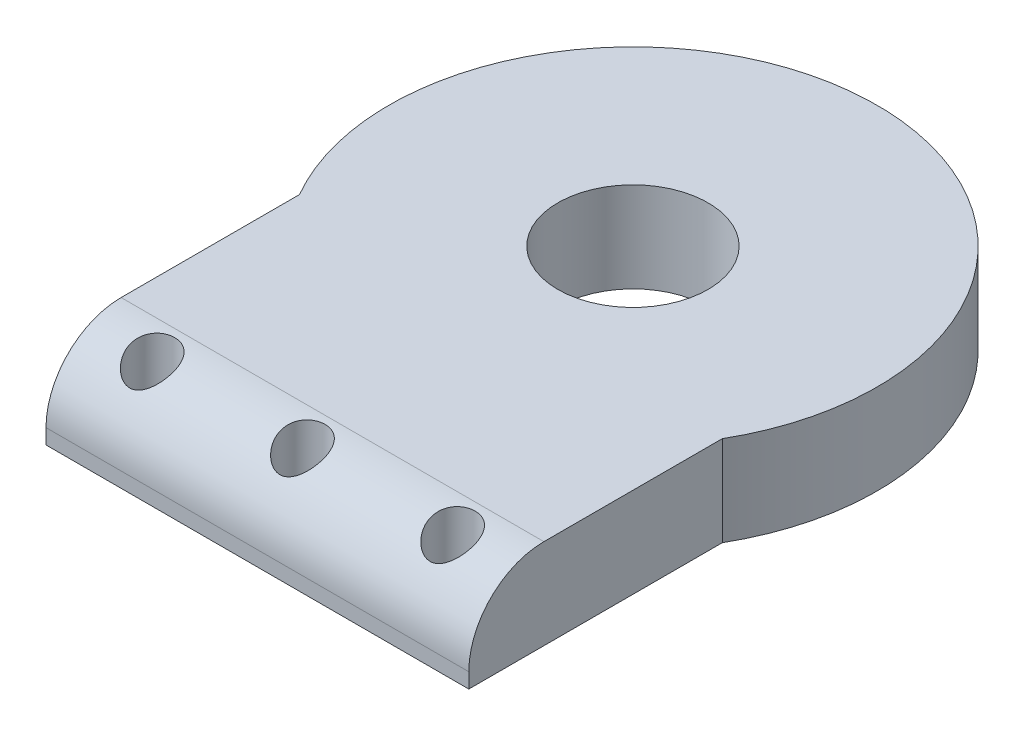
ISO-10303-21;
HEADER;
FILE_DESCRIPTION(('STEP AP214'),'2;1');
FILE_NAME('part.step','',(''),(''),'','','');
FILE_SCHEMA(('AUTOMOTIVE_DESIGN { 1 0 10303 214 1 1 1 1 }'));
ENDSEC;
DATA;
#1=APPLICATION_CONTEXT('core data for automotive mechanical design processes');
#2=APPLICATION_PROTOCOL_DEFINITION('international standard','automotive_design',2000,#1);
#3=PRODUCT_CONTEXT('',#1,'mechanical');
#4=PRODUCT('Part','Part','',(#3));
#5=PRODUCT_RELATED_PRODUCT_CATEGORY('part','',(#4));
#6=PRODUCT_DEFINITION_FORMATION('','',#4);
#7=PRODUCT_DEFINITION_CONTEXT('part definition',#1,'design');
#8=PRODUCT_DEFINITION('design','',#6,#7);
#9=PRODUCT_DEFINITION_SHAPE('','',#8);
#10=(LENGTH_UNIT() NAMED_UNIT(*) SI_UNIT(.MILLI.,.METRE.));
#11=(NAMED_UNIT(*) PLANE_ANGLE_UNIT() SI_UNIT($,.RADIAN.));
#12=(NAMED_UNIT(*) SI_UNIT($,.STERADIAN.) SOLID_ANGLE_UNIT());
#13=UNCERTAINTY_MEASURE_WITH_UNIT(LENGTH_MEASURE(1.E-05),#10,'distance_accuracy_value','');
#14=(GEOMETRIC_REPRESENTATION_CONTEXT(3) GLOBAL_UNCERTAINTY_ASSIGNED_CONTEXT((#13)) GLOBAL_UNIT_ASSIGNED_CONTEXT((#10,
#11,#12)) REPRESENTATION_CONTEXT('',''));
#15=CARTESIAN_POINT('',(0.,0.,0.));
#16=DIRECTION('',(0.,0.,1.));
#17=DIRECTION('',(1.,0.,0.));
#18=AXIS2_PLACEMENT_3D('',#15,#16,#17);
#19=CARTESIAN_POINT('',(0.,12.,-50.));
#20=DIRECTION('',(0.,-1.,0.));
#21=DIRECTION('',(0.,0.,-1.));
#22=AXIS2_PLACEMENT_3D('',#19,#20,#21);
#23=CYLINDRICAL_SURFACE('',#22,32.5);
#24=CARTESIAN_POINT('',(0.,0.,-50.));
#25=DIRECTION('',(0.,1.,0.));
#26=DIRECTION('',(0.,0.,1.));
#27=AXIS2_PLACEMENT_3D('',#24,#25,#26);
#28=CIRCLE('',#27,32.5);
#29=CARTESIAN_POINT('',(28.1458256229943,0.,-33.75));
#30=VERTEX_POINT('',#29);
#31=CARTESIAN_POINT('',(-28.1458256229944,0.,-33.7500000000002));
#32=VERTEX_POINT('',#31);
#33=EDGE_CURVE('E105',#30,#32,#28,.T.);
#34=ORIENTED_EDGE('',*,*,#33,.T.);
#35=DIRECTION('',(0.,-1.,0.));
#36=VECTOR('',#35,1.);
#37=CARTESIAN_POINT('',(-28.1458256229944,12.,-33.7500000000002));
#38=LINE('',#37,#36);
#39=CARTESIAN_POINT('',(-28.1458256229944,12.,-33.7500000000002));
#40=VERTEX_POINT('',#39);
#41=EDGE_CURVE('E92',#40,#32,#38,.T.);
#42=ORIENTED_EDGE('',*,*,#41,.F.);
#43=CARTESIAN_POINT('',(0.,12.,-50.));
#44=DIRECTION('',(0.,1.,0.));
#45=DIRECTION('',(0.,0.,1.));
#46=AXIS2_PLACEMENT_3D('',#43,#44,#45);
#47=CIRCLE('',#46,32.5);
#48=CARTESIAN_POINT('',(28.1458256229943,12.,-33.75));
#49=VERTEX_POINT('',#48);
#50=EDGE_CURVE('E95',#49,#40,#47,.T.);
#51=ORIENTED_EDGE('',*,*,#50,.F.);
#52=DIRECTION('',(0.,-1.,0.));
#53=VECTOR('',#52,1.);
#54=CARTESIAN_POINT('',(28.1458256229943,12.,-33.75));
#55=LINE('',#54,#53);
#56=EDGE_CURVE('E266',#49,#30,#55,.T.);
#57=ORIENTED_EDGE('',*,*,#56,.T.);
#58=EDGE_LOOP('',(#34,#42,#51,#57));
#59=FACE_BOUND('',#58,.T.);
#60=ADVANCED_FACE('F38',(#59),#23,.T.);
#61=CARTESIAN_POINT('',(-28.1458256229944,12.,0.));
#62=DIRECTION('',(-1.,0.,0.));
#63=DIRECTION('',(0.,0.,1.));
#64=AXIS2_PLACEMENT_3D('',#61,#62,#63);
#65=PLANE('',#64);
#66=DIRECTION('',(0.,-1.,0.));
#67=VECTOR('',#66,1.);
#68=CARTESIAN_POINT('',(-28.1458256229944,12.,0.));
#69=LINE('',#68,#67);
#70=CARTESIAN_POINT('',(-28.1458256229944,2.,0.));
#71=VERTEX_POINT('',#70);
#72=CARTESIAN_POINT('',(-28.1458256229944,0.,0.));
#73=VERTEX_POINT('',#72);
#74=EDGE_CURVE('E108',#71,#73,#69,.T.);
#75=ORIENTED_EDGE('',*,*,#74,.F.);
#76=CARTESIAN_POINT('',(-28.1458256229944,2.,-10.));
#77=DIRECTION('',(-1.,0.,0.));
#78=DIRECTION('',(0.,0.,1.));
#79=AXIS2_PLACEMENT_3D('',#76,#77,#78);
#80=CIRCLE('',#79,10.);
#81=CARTESIAN_POINT('',(-28.1458256229944,12.,-10.));
#82=VERTEX_POINT('',#81);
#83=EDGE_CURVE('E67',#71,#82,#80,.T.);
#84=ORIENTED_EDGE('',*,*,#83,.T.);
#85=DIRECTION('',(0.,0.,-1.));
#86=VECTOR('',#85,1.);
#87=CARTESIAN_POINT('',(-28.1458256229944,12.,0.));
#88=LINE('',#87,#86);
#89=EDGE_CURVE('E87',#82,#40,#88,.T.);
#90=ORIENTED_EDGE('',*,*,#89,.T.);
#91=ORIENTED_EDGE('',*,*,#41,.T.);
#92=DIRECTION('',(0.,0.,-1.));
#93=VECTOR('',#92,1.);
#94=CARTESIAN_POINT('',(-28.1458256229944,0.,0.));
#95=LINE('',#94,#93);
#96=EDGE_CURVE('E268',#73,#32,#95,.T.);
#97=ORIENTED_EDGE('',*,*,#96,.F.);
#98=EDGE_LOOP('',(#75,#84,#90,#91,#97));
#99=FACE_BOUND('',#98,.T.);
#100=ADVANCED_FACE('F89',(#99),#65,.T.);
#101=CARTESIAN_POINT('',(0.,12.,0.));
#102=DIRECTION('',(0.,0.,1.));
#103=DIRECTION('',(1.,0.,0.));
#104=AXIS2_PLACEMENT_3D('',#101,#102,#103);
#105=PLANE('',#104);
#106=DIRECTION('',(0.,-1.,0.));
#107=VECTOR('',#106,1.);
#108=CARTESIAN_POINT('',(28.1458256229942,12.,0.));
#109=LINE('',#108,#107);
#110=CARTESIAN_POINT('',(28.1458256229942,2.,0.));
#111=VERTEX_POINT('',#110);
#112=CARTESIAN_POINT('',(28.1458256229942,0.,0.));
#113=VERTEX_POINT('',#112);
#114=EDGE_CURVE('E112',#111,#113,#109,.T.);
#115=ORIENTED_EDGE('',*,*,#114,.F.);
#116=DIRECTION('',(-1.,0.,0.));
#117=VECTOR('',#116,1.);
#118=CARTESIAN_POINT('',(0.,2.,0.));
#119=LINE('',#118,#117);
#120=EDGE_CURVE('E107',#111,#71,#119,.T.);
#121=ORIENTED_EDGE('',*,*,#120,.T.);
#122=ORIENTED_EDGE('',*,*,#74,.T.);
#123=DIRECTION('',(-1.,0.,0.));
#124=VECTOR('',#123,1.);
#125=CARTESIAN_POINT('',(0.,0.,0.));
#126=LINE('',#125,#124);
#127=EDGE_CURVE('E270',#113,#73,#126,.T.);
#128=ORIENTED_EDGE('',*,*,#127,.F.);
#129=EDGE_LOOP('',(#115,#121,#122,#128));
#130=FACE_BOUND('',#129,.T.);
#131=ADVANCED_FACE('F148',(#130),#105,.T.);
#132=CARTESIAN_POINT('',(28.1458256229942,12.,0.));
#133=DIRECTION('',(-1.,0.,0.));
#134=DIRECTION('',(0.,0.,1.));
#135=AXIS2_PLACEMENT_3D('',#132,#133,#134);
#136=PLANE('',#135);
#137=DIRECTION('',(0.,0.,-1.));
#138=VECTOR('',#137,1.);
#139=CARTESIAN_POINT('',(28.1458256229942,12.,0.));
#140=LINE('',#139,#138);
#141=CARTESIAN_POINT('',(28.1458256229942,12.,-10.));
#142=VERTEX_POINT('',#141);
#143=EDGE_CURVE('E94',#142,#49,#140,.T.);
#144=ORIENTED_EDGE('',*,*,#143,.F.);
#145=CARTESIAN_POINT('',(28.1458256229942,2.,-10.));
#146=DIRECTION('',(-1.,0.,0.));
#147=DIRECTION('',(0.,0.,1.));
#148=AXIS2_PLACEMENT_3D('',#145,#146,#147);
#149=CIRCLE('',#148,10.);
#150=EDGE_CURVE('E11',#142,#111,#149,.F.);
#151=ORIENTED_EDGE('',*,*,#150,.T.);
#152=ORIENTED_EDGE('',*,*,#114,.T.);
#153=DIRECTION('',(0.,0.,-1.));
#154=VECTOR('',#153,1.);
#155=CARTESIAN_POINT('',(28.1458256229942,0.,0.));
#156=LINE('',#155,#154);
#157=EDGE_CURVE('E102',#113,#30,#156,.T.);
#158=ORIENTED_EDGE('',*,*,#157,.T.);
#159=ORIENTED_EDGE('',*,*,#56,.F.);
#160=EDGE_LOOP('',(#144,#151,#152,#158,#159));
#161=FACE_BOUND('',#160,.T.);
#162=ADVANCED_FACE('F141',(#161),#136,.F.);
#163=CARTESIAN_POINT('',(0.,12.,0.));
#164=DIRECTION('',(0.,1.,0.));
#165=DIRECTION('',(0.,0.,1.));
#166=AXIS2_PLACEMENT_3D('',#163,#164,#165);
#167=PLANE('',#166);
#168=CARTESIAN_POINT('',(0.,12.,-50.));
#169=DIRECTION('',(0.,1.,0.));
#170=DIRECTION('',(0.,0.,1.));
#171=AXIS2_PLACEMENT_3D('',#168,#169,#170);
#172=CIRCLE('',#171,10.);
#173=CARTESIAN_POINT('',(0.,12.,-40.));
#174=VERTEX_POINT('',#173);
#175=EDGE_CURVE('E254',#174,#174,#172,.T.);
#176=ORIENTED_EDGE('',*,*,#175,.F.);
#177=EDGE_LOOP('',(#176));
#178=FACE_BOUND('',#177,.T.);
#179=ORIENTED_EDGE('',*,*,#89,.F.);
#180=DIRECTION('',(-1.,0.,0.));
#181=VECTOR('',#180,1.);
#182=CARTESIAN_POINT('',(0.,12.,-10.));
#183=LINE('',#182,#181);
#184=EDGE_CURVE('E52',#82,#142,#183,.F.);
#185=ORIENTED_EDGE('',*,*,#184,.T.);
#186=ORIENTED_EDGE('',*,*,#143,.T.);
#187=ORIENTED_EDGE('',*,*,#50,.T.);
#188=EDGE_LOOP('',(#179,#185,#186,#187));
#189=FACE_BOUND('',#188,.T.);
#190=ADVANCED_FACE('F98',(#178,#189),#167,.T.);
#191=CARTESIAN_POINT('',(0.,0.,0.));
#192=DIRECTION('',(0.,1.,0.));
#193=DIRECTION('',(0.,0.,1.));
#194=AXIS2_PLACEMENT_3D('',#191,#192,#193);
#195=PLANE('',#194);
#196=CARTESIAN_POINT('',(0.,0.,-50.));
#197=DIRECTION('',(0.,1.,0.));
#198=DIRECTION('',(0.,0.,1.));
#199=AXIS2_PLACEMENT_3D('',#196,#197,#198);
#200=CIRCLE('',#199,10.);
#201=CARTESIAN_POINT('',(0.,0.,-40.));
#202=VERTEX_POINT('',#201);
#203=EDGE_CURVE('E251',#202,#202,#200,.T.);
#204=ORIENTED_EDGE('',*,*,#203,.T.);
#205=EDGE_LOOP('',(#204));
#206=FACE_BOUND('',#205,.T.);
#207=CARTESIAN_POINT('',(20.,0.,-6.));
#208=DIRECTION('',(0.,-1.,0.));
#209=DIRECTION('',(0.,0.,-1.));
#210=AXIS2_PLACEMENT_3D('',#207,#208,#209);
#211=CIRCLE('',#210,3.);
#212=CARTESIAN_POINT('',(20.,0.,-8.99999999999999));
#213=VERTEX_POINT('',#212);
#214=EDGE_CURVE('E258',#213,#213,#211,.T.);
#215=ORIENTED_EDGE('',*,*,#214,.F.);
#216=EDGE_LOOP('',(#215));
#217=FACE_BOUND('',#216,.T.);
#218=CARTESIAN_POINT('',(0.,0.,-6.));
#219=DIRECTION('',(0.,-1.,0.));
#220=DIRECTION('',(0.,0.,-1.));
#221=AXIS2_PLACEMENT_3D('',#218,#219,#220);
#222=CIRCLE('',#221,3.);
#223=CARTESIAN_POINT('',(0.,0.,-9.));
#224=VERTEX_POINT('',#223);
#225=EDGE_CURVE('E124',#224,#224,#222,.T.);
#226=ORIENTED_EDGE('',*,*,#225,.F.);
#227=EDGE_LOOP('',(#226));
#228=FACE_BOUND('',#227,.T.);
#229=CARTESIAN_POINT('',(-20.,0.,-6.));
#230=DIRECTION('',(0.,-1.,0.));
#231=DIRECTION('',(0.,0.,-1.));
#232=AXIS2_PLACEMENT_3D('',#229,#230,#231);
#233=CIRCLE('',#232,3.);
#234=CARTESIAN_POINT('',(-20.,0.,-9.));
#235=VERTEX_POINT('',#234);
#236=EDGE_CURVE('E125',#235,#235,#233,.T.);
#237=ORIENTED_EDGE('',*,*,#236,.F.);
#238=EDGE_LOOP('',(#237));
#239=FACE_BOUND('',#238,.T.);
#240=ORIENTED_EDGE('',*,*,#33,.F.);
#241=ORIENTED_EDGE('',*,*,#157,.F.);
#242=ORIENTED_EDGE('',*,*,#127,.T.);
#243=ORIENTED_EDGE('',*,*,#96,.T.);
#244=EDGE_LOOP('',(#240,#241,#242,#243));
#245=FACE_BOUND('',#244,.T.);
#246=ADVANCED_FACE('F136',(#206,#217,#228,#239,#245),#195,.F.);
#247=CARTESIAN_POINT('',(-20.,12.,-6.));
#248=DIRECTION('',(0.,-1.,0.));
#249=DIRECTION('',(0.,0.,-1.));
#250=AXIS2_PLACEMENT_3D('',#247,#248,#249);
#251=CYLINDRICAL_SURFACE('',#250,3.);
#252=CARTESIAN_POINT('',(-20.,9.14142842854285,-3.));
#253=CARTESIAN_POINT('',(-20.0694952322062,9.14142887108168,-3.00000038806852));
#254=CARTESIAN_POINT('',(-20.1389906559435,9.14380479606183,-3.00242149040504));
#255=CARTESIAN_POINT('',(-20.2773424620956,9.1532131840239,-3.01204037627337));
#256=CARTESIAN_POINT('',(-20.3461985501409,9.16024769367483,-3.01924025928337));
#257=CARTESIAN_POINT('',(-20.5509182289806,9.18803483057215,-3.04781278451008));
#258=CARTESIAN_POINT('',(-20.68499458089,9.21547136517354,-3.07615849462181));
#259=CARTESIAN_POINT('',(-20.9432016810088,9.28464269019733,-3.14898420388817));
#260=CARTESIAN_POINT('',(-21.0674080895316,9.32625240054425,-3.19332325507404));
#261=CARTESIAN_POINT('',(-21.3055666987639,9.42020825713683,-3.2958700281069));
#262=CARTESIAN_POINT('',(-21.4195115505237,9.47256201126463,-3.35408758210131));
#263=CARTESIAN_POINT('',(-21.6848625672596,9.60983642019785,-3.51112473718235));
#264=CARTESIAN_POINT('',(-21.8302861892182,9.69886244040284,-3.61646805903595));
#265=CARTESIAN_POINT('',(-22.097552761373,9.88502631431775,-3.84788630528328));
#266=CARTESIAN_POINT('',(-22.2193594493658,9.98217631961343,-3.97399256935345));
#267=CARTESIAN_POINT('',(-22.4403897317498,10.1806441443469,-4.24622634116217));
#268=CARTESIAN_POINT('',(-22.5392165703612,10.2820039455086,-4.39264446233099));
#269=CARTESIAN_POINT('',(-22.7101881276202,10.4829368119101,-4.70154234167674));
#270=CARTESIAN_POINT('',(-22.782335941277,10.5825100831276,-4.86402023400119));
#271=CARTESIAN_POINT('',(-22.8713622247846,10.7321377353829,-5.12545437711432));
#272=CARTESIAN_POINT('',(-22.8984769872694,10.7842096678664,-5.21988272737849));
#273=CARTESIAN_POINT('',(-22.9434803756105,10.8860993712432,-5.41207700329108));
#274=CARTESIAN_POINT('',(-22.9613731963036,10.9359181576133,-5.50984138984191));
#275=CARTESIAN_POINT('',(-22.9874312943285,11.0327828920813,-5.70803001916108));
#276=CARTESIAN_POINT('',(-22.9955950607393,11.0798284084126,-5.80845467259371));
#277=CARTESIAN_POINT('',(-23.0016888231736,11.170627969125,-6.01102932735026));
#278=CARTESIAN_POINT('',(-22.9996255422491,11.2143841566402,-6.1131781512294));
#279=CARTESIAN_POINT('',(-22.9855758173423,11.2940720304324,-6.30809057192903));
#280=CARTESIAN_POINT('',(-22.9745890907601,11.3303497199042,-6.40078517834078));
#281=CARTESIAN_POINT('',(-22.9437319839013,11.3996503759801,-6.58586352463774));
#282=CARTESIAN_POINT('',(-22.9238666792908,11.4326751890288,-6.67824741179439));
#283=CARTESIAN_POINT('',(-22.8751362083019,11.4953002793274,-6.86174139081995));
#284=CARTESIAN_POINT('',(-22.8462758731605,11.5249023832431,-6.95285213911047));
#285=CARTESIAN_POINT('',(-22.7795558018059,11.5806124418036,-7.13281752933004));
#286=CARTESIAN_POINT('',(-22.7416971717117,11.6067208252992,-7.22167244707323));
#287=CARTESIAN_POINT('',(-22.6624152789111,11.6524109260444,-7.38518655610244));
#288=CARTESIAN_POINT('',(-22.6220249107882,11.6724005304708,-7.46023444855253));
#289=CARTESIAN_POINT('',(-22.5346578056577,11.7097805547414,-7.60711348780644));
#290=CARTESIAN_POINT('',(-22.4876788516952,11.7271700956191,-7.67894354107964));
#291=CARTESIAN_POINT('',(-22.3874599783368,11.759444719848,-7.81863010307979));
#292=CARTESIAN_POINT('',(-22.3342239381296,11.7743313411571,-7.88648903508668));
#293=CARTESIAN_POINT('',(-22.2218432754819,11.8017732369677,-8.01764359013467));
#294=CARTESIAN_POINT('',(-22.1626965123823,11.8143276620882,-8.08093754550647));
#295=CARTESIAN_POINT('',(-21.9835919874194,11.8475488483159,-8.25659874217768));
#296=CARTESIAN_POINT('',(-21.8564716146997,11.8654563678006,-8.36235029050059));
#297=CARTESIAN_POINT('',(-21.5861723604859,11.8950373121125,-8.55173176588097));
#298=CARTESIAN_POINT('',(-21.4429940443773,11.9067109563455,-8.63536247144524));
#299=CARTESIAN_POINT('',(-21.144444145349,11.9253244064913,-8.77806191687992));
#300=CARTESIAN_POINT('',(-20.9890631712982,11.932260525813,-8.83711151459233));
#301=CARTESIAN_POINT('',(-20.6705832027884,11.9425674238183,-8.92878597964236));
#302=CARTESIAN_POINT('',(-20.5074838152113,11.9459380206964,-8.96140949949777));
#303=CARTESIAN_POINT('',(-20.1765464670162,11.9498402957314,-8.99947172278637));
#304=CARTESIAN_POINT('',(-20.008678336825,11.9503449233469,-9.00465136575774));
#305=CARTESIAN_POINT('',(-19.6744357290206,11.9485604310952,-8.9869747327959));
#306=CARTESIAN_POINT('',(-19.5080613001184,11.9462712204497,-8.96411754587882));
#307=CARTESIAN_POINT('',(-19.1810805022849,11.9383762308806,-8.89093590971619));
#308=CARTESIAN_POINT('',(-19.0204905359209,11.9327617045525,-8.84053904315058));
#309=CARTESIAN_POINT('',(-18.7101529757789,11.9171363161511,-8.71374048971687));
#310=CARTESIAN_POINT('',(-18.5604051032766,11.9071255671409,-8.63733947164117));
#311=CARTESIAN_POINT('',(-18.2767200931827,11.8813095381268,-8.46130971757189));
#312=CARTESIAN_POINT('',(-18.1427157669816,11.8655301592252,-8.36178552141573));
#313=CARTESIAN_POINT('',(-17.893612199175,11.8266138574999,-8.14257947381756));
#314=CARTESIAN_POINT('',(-17.7785103415512,11.8034779540901,-8.02290041637083));
#315=CARTESIAN_POINT('',(-17.5714004393837,11.7487562646368,-7.76875792629162));
#316=CARTESIAN_POINT('',(-17.4791712272326,11.7172580372412,-7.63445574411327));
#317=CARTESIAN_POINT('',(-17.3184278599007,11.6448542980495,-7.3546954304027));
#318=CARTESIAN_POINT('',(-17.2499125775213,11.6039492335441,-7.20923782952459));
#319=CARTESIAN_POINT('',(-17.1372067723352,11.5122441889089,-6.91103855297766));
#320=CARTESIAN_POINT('',(-17.0931748303703,11.4613825210957,-6.7582561965224));
#321=CARTESIAN_POINT('',(-17.0299348923542,11.3504492123843,-6.45094216863011));
#322=CARTESIAN_POINT('',(-17.0107331561699,11.2903752532719,-6.29641006597134));
#323=CARTESIAN_POINT('',(-16.9956585488981,11.1583570934601,-5.98061323488194));
#324=CARTESIAN_POINT('',(-17.0012252621132,11.085922351007,-5.81948756598026));
#325=CARTESIAN_POINT('',(-17.0370825944752,10.9338162931612,-5.50358790786637));
#326=CARTESIAN_POINT('',(-17.0673809877569,10.8541427093168,-5.34881593193786));
#327=CARTESIAN_POINT('',(-17.1554640150008,10.6802116473825,-5.03105931393388));
#328=CARTESIAN_POINT('',(-17.2160134958811,10.5853315523117,-4.86918325821145));
#329=CARTESIAN_POINT('',(-17.3629274983785,10.3924602432952,-4.5594125811214));
#330=CARTESIAN_POINT('',(-17.4493240977728,10.2944652994993,-4.41153563543392));
#331=CARTESIAN_POINT('',(-17.6575406929387,10.0879706490476,-4.11605538597025));
#332=CARTESIAN_POINT('',(-17.7822946847135,9.97956112786815,-3.97044562955245));
#333=CARTESIAN_POINT('',(-18.0605405073693,9.77033310043863,-3.70312617569753));
#334=CARTESIAN_POINT('',(-18.2139949771936,9.66950496164404,-3.58138582340539));
#335=CARTESIAN_POINT('',(-18.497429536117,9.51308476605503,-3.39975180363243));
#336=CARTESIAN_POINT('',(-18.620186595865,9.45310035806787,-3.33233906449569));
#337=CARTESIAN_POINT('',(-18.8785109869713,9.34542560414058,-3.21390200572334));
#338=CARTESIAN_POINT('',(-19.0140619306823,9.29771981495784,-3.16285707965191));
#339=CARTESIAN_POINT('',(-19.2218009977847,9.23990135492237,-3.10184330405522));
#340=CARTESIAN_POINT('',(-19.2900330255728,9.22317918477218,-3.08435672124092));
#341=CARTESIAN_POINT('',(-19.4284303430924,9.19409097264606,-3.05410219521265));
#342=CARTESIAN_POINT('',(-19.4985945185152,9.18172247429053,-3.04133159100201));
#343=CARTESIAN_POINT('',(-19.64026733224,9.16175858874067,-3.02078654007388));
#344=CARTESIAN_POINT('',(-19.7117748741976,9.15415946977922,-3.01300818709675));
#345=CARTESIAN_POINT('',(-19.8555215674077,9.14399429119416,-3.00261485028941));
#346=CARTESIAN_POINT('',(-19.9277606802262,9.14142796852995,-2.99999959660822));
#347=CARTESIAN_POINT('',(-20.,9.14142842854285,-3.));
#348=B_SPLINE_CURVE_WITH_KNOTS('',3,(#252,#253,#254,#255,#256,#257,#258,#259,#260,#261,#262,
#263,#264,#265,#266,#267,#268,#269,#270,#271,#272,#273,#274,#275,#276,#277,#278,#279,#280,#281,
#282,#283,#284,#285,#286,#287,#288,#289,#290,#291,#292,#293,#294,#295,#296,#297,#298,#299,#300,
#301,#302,#303,#304,#305,#306,#307,#308,#309,#310,#311,#312,#313,#314,#315,#316,#317,#318,#319,
#320,#321,#322,#323,#324,#325,#326,#327,#328,#329,#330,#331,#332,#333,#334,#335,#336,#337,#338,
#339,#340,#341,#342,#343,#344,#345,#346,#347),.UNSPECIFIED.,.T.,.F.,(4,2,2,2,2,2,2,2,2,2,2,2,2,
2,2,2,2,2,2,2,2,2,2,2,2,2,2,2,2,2,2,2,2,2,2,2,2,2,2,2,2,2,2,2,2,2,2,4),(0.,0.208397164328742,
0.416885945158228,0.833682459890278,1.24689210149178,1.6603953536771,2.25848095870829,
2.8574777350657,3.4661543830467,4.07476039684089,4.40794975195072,4.74098741327407,
5.07407678857095,5.40694722676666,5.70695686436446,6.00679521272579,6.30647279442557,
6.60611355717251,6.8683964941828,7.13076789794569,7.39297748960867,7.65528239105525,
8.15167966019337,8.64805945711811,9.14482508227505,9.64161603622727,10.1430882727615,
10.6445768037633,11.1473904207705,11.6501911070531,12.1507614062111,12.6512623701599,
13.1467164277906,13.6421469316795,14.1407500778875,14.6394789009094,15.1675613997086,
15.6958099594579,16.2849262316285,16.8747766859212,17.5325700624611,18.1895130375441,
18.6450837389603,19.1000786220824,19.317008318161,19.5338154236867,19.7504526778468,
19.9670786090941),.UNSPECIFIED.);
#349=CARTESIAN_POINT('',(-20.,9.14142842854285,-3.));
#350=VERTEX_POINT('',#349);
#351=EDGE_CURVE('E118',#350,#350,#348,.T.);
#352=ORIENTED_EDGE('',*,*,#351,.F.);
#353=EDGE_LOOP('',(#352));
#354=FACE_BOUND('',#353,.T.);
#355=ORIENTED_EDGE('',*,*,#236,.T.);
#356=EDGE_LOOP('',(#355));
#357=FACE_BOUND('',#356,.T.);
#358=ADVANCED_FACE('F131',(#354,#357),#251,.F.);
#359=CARTESIAN_POINT('',(0.,12.,-6.));
#360=DIRECTION('',(0.,-1.,0.));
#361=DIRECTION('',(0.,0.,-1.));
#362=AXIS2_PLACEMENT_3D('',#359,#360,#361);
#363=CYLINDRICAL_SURFACE('',#362,3.);
#364=CARTESIAN_POINT('',(0.,9.14142842854285,-3.));
#365=CARTESIAN_POINT('',(-0.0694952322061521,9.14142887108168,-3.00000038806852));
#366=CARTESIAN_POINT('',(-0.138990655943474,9.14380479606183,-3.00242149040504));
#367=CARTESIAN_POINT('',(-0.277342462095647,9.15321318402389,-3.01204037627337));
#368=CARTESIAN_POINT('',(-0.346198550140911,9.16024769367483,-3.01924025928336));
#369=CARTESIAN_POINT('',(-0.550918228980576,9.18803483057215,-3.04781278451008));
#370=CARTESIAN_POINT('',(-0.68499458089004,9.21547136517354,-3.0761584946218));
#371=CARTESIAN_POINT('',(-0.943201681008765,9.28464269019732,-3.14898420388817));
#372=CARTESIAN_POINT('',(-1.06740808953156,9.32625240054425,-3.19332325507404));
#373=CARTESIAN_POINT('',(-1.30556669876392,9.42020825713683,-3.2958700281069));
#374=CARTESIAN_POINT('',(-1.41951155052373,9.47256201126463,-3.35408758210131));
#375=CARTESIAN_POINT('',(-1.68486256725957,9.60983642019784,-3.51112473718235));
#376=CARTESIAN_POINT('',(-1.83028618921816,9.69886244040284,-3.61646805903594));
#377=CARTESIAN_POINT('',(-2.09755276137304,9.88502631431775,-3.84788630528328));
#378=CARTESIAN_POINT('',(-2.21935944936582,9.98217631961342,-3.97399256935345));
#379=CARTESIAN_POINT('',(-2.44038973174975,10.1806441443469,-4.24622634116216));
#380=CARTESIAN_POINT('',(-2.53921657036118,10.2820039455086,-4.39264446233099));
#381=CARTESIAN_POINT('',(-2.71018812762024,10.4829368119101,-4.70154234167674));
#382=CARTESIAN_POINT('',(-2.78233594127701,10.5825100831276,-4.86402023400119));
#383=CARTESIAN_POINT('',(-2.87136222478455,10.7321377353829,-5.12545437711432));
#384=CARTESIAN_POINT('',(-2.89847698726943,10.7842096678664,-5.21988272737848));
#385=CARTESIAN_POINT('',(-2.94348037561053,10.8860993712432,-5.41207700329108));
#386=CARTESIAN_POINT('',(-2.96137319630358,10.9359181576133,-5.5098413898419));
#387=CARTESIAN_POINT('',(-2.98743129432846,11.0327828920813,-5.70803001916107));
#388=CARTESIAN_POINT('',(-2.99559506073929,11.0798284084126,-5.8084546725937));
#389=CARTESIAN_POINT('',(-3.00168882317357,11.170627969125,-6.01102932735025));
#390=CARTESIAN_POINT('',(-2.9996255422491,11.2143841566402,-6.11317815122939));
#391=CARTESIAN_POINT('',(-2.98557581734228,11.2940720304324,-6.30809057192902));
#392=CARTESIAN_POINT('',(-2.97458909076006,11.3303497199042,-6.40078517834077));
#393=CARTESIAN_POINT('',(-2.94373198390132,11.3996503759801,-6.58586352463774));
#394=CARTESIAN_POINT('',(-2.92386667929082,11.4326751890288,-6.67824741179438));
#395=CARTESIAN_POINT('',(-2.87513620830192,11.4953002793274,-6.86174139081995));
#396=CARTESIAN_POINT('',(-2.84627587316048,11.5249023832431,-6.95285213911047));
#397=CARTESIAN_POINT('',(-2.77955580180586,11.5806124418036,-7.13281752933004));
#398=CARTESIAN_POINT('',(-2.7416971717117,11.6067208252992,-7.22167244707323));
#399=CARTESIAN_POINT('',(-2.66241527891115,11.6524109260444,-7.38518655610244));
#400=CARTESIAN_POINT('',(-2.62202491078817,11.6724005304708,-7.46023444855253));
#401=CARTESIAN_POINT('',(-2.53465780565766,11.7097805547414,-7.60711348780644));
#402=CARTESIAN_POINT('',(-2.48767885169522,11.7271700956191,-7.67894354107964));
#403=CARTESIAN_POINT('',(-2.38745997833681,11.759444719848,-7.81863010307979));
#404=CARTESIAN_POINT('',(-2.33422393812957,11.7743313411571,-7.88648903508668));
#405=CARTESIAN_POINT('',(-2.22184327548195,11.8017732369677,-8.01764359013467));
#406=CARTESIAN_POINT('',(-2.16269651238232,11.8143276620882,-8.08093754550647));
#407=CARTESIAN_POINT('',(-1.98359198741938,11.8475488483159,-8.25659874217768));
#408=CARTESIAN_POINT('',(-1.85647161469971,11.8654563678006,-8.3623502905006));
#409=CARTESIAN_POINT('',(-1.58617236048587,11.8950373121125,-8.55173176588098));
#410=CARTESIAN_POINT('',(-1.44299404437732,11.9067109563455,-8.63536247144524));
#411=CARTESIAN_POINT('',(-1.14444414534896,11.9253244064913,-8.77806191687992));
#412=CARTESIAN_POINT('',(-0.989063171298247,11.932260525813,-8.83711151459233));
#413=CARTESIAN_POINT('',(-0.670583202788422,11.9425674238183,-8.92878597964236));
#414=CARTESIAN_POINT('',(-0.507483815211344,11.9459380206964,-8.96140949949777));
#415=CARTESIAN_POINT('',(-0.176546467016235,11.9498402957314,-8.99947172278637));
#416=CARTESIAN_POINT('',(-0.00867833682499015,11.9503449233469,-9.00465136575774));
#417=CARTESIAN_POINT('',(0.325564270979378,11.9485604310952,-8.9869747327959));
#418=CARTESIAN_POINT('',(0.491938699881624,11.9462712204497,-8.96411754587882));
#419=CARTESIAN_POINT('',(0.81891949771514,11.9383762308806,-8.89093590971619));
#420=CARTESIAN_POINT('',(0.979509464079092,11.9327617045525,-8.84053904315058));
#421=CARTESIAN_POINT('',(1.28984702422112,11.9171363161511,-8.71374048971688));
#422=CARTESIAN_POINT('',(1.43959489672342,11.9071255671409,-8.63733947164118));
#423=CARTESIAN_POINT('',(1.72327990681733,11.8813095381268,-8.4613097175719));
#424=CARTESIAN_POINT('',(1.85728423301837,11.8655301592252,-8.36178552141574));
#425=CARTESIAN_POINT('',(2.10638780082498,11.8266138574999,-8.14257947381757));
#426=CARTESIAN_POINT('',(2.22148965844883,11.8034779540901,-8.02290041637083));
#427=CARTESIAN_POINT('',(2.42859956061633,11.7487562646368,-7.76875792629162));
#428=CARTESIAN_POINT('',(2.52082877276736,11.7172580372412,-7.63445574411328));
#429=CARTESIAN_POINT('',(2.68157214009932,11.6448542980495,-7.35469543040271));
#430=CARTESIAN_POINT('',(2.75008742247871,11.6039492335441,-7.2092378295246));
#431=CARTESIAN_POINT('',(2.86279322766476,11.5122441889089,-6.91103855297767));
#432=CARTESIAN_POINT('',(2.90682516962974,11.4613825210957,-6.7582561965224));
#433=CARTESIAN_POINT('',(2.9700651076458,11.3504492123843,-6.45094216863012));
#434=CARTESIAN_POINT('',(2.98926684383011,11.2903752532719,-6.29641006597134));
#435=CARTESIAN_POINT('',(3.00434145110193,11.1583570934602,-5.98061323488195));
#436=CARTESIAN_POINT('',(2.99877473788677,11.085922351007,-5.81948756598026));
#437=CARTESIAN_POINT('',(2.96291740552485,10.9338162931612,-5.50358790786638));
#438=CARTESIAN_POINT('',(2.93261901224312,10.8541427093168,-5.34881593193787));
#439=CARTESIAN_POINT('',(2.84453598499916,10.6802116473825,-5.03105931393389));
#440=CARTESIAN_POINT('',(2.78398650411889,10.5853315523117,-4.86918325821146));
#441=CARTESIAN_POINT('',(2.63707250162147,10.3924602432952,-4.55941258112141));
#442=CARTESIAN_POINT('',(2.55067590222722,10.2944652994993,-4.41153563543392));
#443=CARTESIAN_POINT('',(2.34245930706127,10.0879706490476,-4.11605538597025));
#444=CARTESIAN_POINT('',(2.2177053152865,9.97956112786816,-3.97044562955245));
#445=CARTESIAN_POINT('',(1.9394594926307,9.77033310043864,-3.70312617569754));
#446=CARTESIAN_POINT('',(1.7860050228064,9.66950496164404,-3.58138582340539));
#447=CARTESIAN_POINT('',(1.50257046388303,9.51308476605503,-3.39975180363243));
#448=CARTESIAN_POINT('',(1.37981340413498,9.45310035806787,-3.33233906449569));
#449=CARTESIAN_POINT('',(1.1214890130287,9.34542560414058,-3.21390200572334));
#450=CARTESIAN_POINT('',(0.985938069317741,9.29771981495783,-3.16285707965191));
#451=CARTESIAN_POINT('',(0.778199002215261,9.23990135492237,-3.10184330405522));
#452=CARTESIAN_POINT('',(0.709966974427162,9.22317918477217,-3.08435672124092));
#453=CARTESIAN_POINT('',(0.571569656907634,9.19409097264606,-3.05410219521265));
#454=CARTESIAN_POINT('',(0.501405481484804,9.18172247429052,-3.04133159100201));
#455=CARTESIAN_POINT('',(0.359732667759964,9.16175858874067,-3.02078654007388));
#456=CARTESIAN_POINT('',(0.28822512580241,9.15415946977922,-3.01300818709675));
#457=CARTESIAN_POINT('',(0.14447843259227,9.14399429119416,-3.00261485028941));
#458=CARTESIAN_POINT('',(0.0722393197738288,9.14142796852995,-2.99999959660822));
#459=CARTESIAN_POINT('',(0.,9.14142842854285,-3.));
#460=B_SPLINE_CURVE_WITH_KNOTS('',3,(#364,#365,#366,#367,#368,#369,#370,#371,#372,#373,#374,
#375,#376,#377,#378,#379,#380,#381,#382,#383,#384,#385,#386,#387,#388,#389,#390,#391,#392,#393,
#394,#395,#396,#397,#398,#399,#400,#401,#402,#403,#404,#405,#406,#407,#408,#409,#410,#411,#412,
#413,#414,#415,#416,#417,#418,#419,#420,#421,#422,#423,#424,#425,#426,#427,#428,#429,#430,#431,
#432,#433,#434,#435,#436,#437,#438,#439,#440,#441,#442,#443,#444,#445,#446,#447,#448,#449,#450,
#451,#452,#453,#454,#455,#456,#457,#458,#459),.UNSPECIFIED.,.T.,.F.,(4,2,2,2,2,2,2,2,2,2,2,2,2,
2,2,2,2,2,2,2,2,2,2,2,2,2,2,2,2,2,2,2,2,2,2,2,2,2,2,2,2,2,2,2,2,2,2,4),(0.,0.208397164328744,
0.41688594515823,0.833682459890279,1.24689210149178,1.6603953536771,2.25848095870828,
2.8574777350657,3.4661543830467,4.07476039684089,4.40794975195072,4.74098741327407,
5.07407678857095,5.40694722676666,5.70695686436446,6.00679521272579,6.30647279442558,
6.60611355717252,6.8683964941828,7.13076789794569,7.39297748960867,7.65528239105525,
8.15167966019338,8.64805945711812,9.14482508227505,9.64161603622727,10.1430882727615,
10.6445768037633,11.1473904207705,11.6501911070531,12.1507614062111,12.6512623701599,
13.1467164277906,13.6421469316795,14.1407500778875,14.6394789009094,15.1675613997086,
15.6958099594579,16.2849262316285,16.8747766859212,17.5325700624612,18.1895130375441,
18.6450837389603,19.1000786220824,19.3170083181611,19.5338154236867,19.7504526778468,
19.9670786090941),.UNSPECIFIED.);
#461=CARTESIAN_POINT('',(0.,9.14142842854285,-3.));
#462=VERTEX_POINT('',#461);
#463=EDGE_CURVE('E126',#462,#462,#460,.T.);
#464=ORIENTED_EDGE('',*,*,#463,.F.);
#465=EDGE_LOOP('',(#464));
#466=FACE_BOUND('',#465,.T.);
#467=ORIENTED_EDGE('',*,*,#225,.T.);
#468=EDGE_LOOP('',(#467));
#469=FACE_BOUND('',#468,.T.);
#470=ADVANCED_FACE('F135',(#466,#469),#363,.F.);
#471=CARTESIAN_POINT('',(20.,12.,-6.));
#472=DIRECTION('',(0.,-1.,0.));
#473=DIRECTION('',(0.,0.,-1.));
#474=AXIS2_PLACEMENT_3D('',#471,#472,#473);
#475=CYLINDRICAL_SURFACE('',#474,3.);
#476=CARTESIAN_POINT('',(20.,9.14142842854285,-3.));
#477=CARTESIAN_POINT('',(19.9305047677938,9.14142887108167,-3.00000038806851));
#478=CARTESIAN_POINT('',(19.8610093440565,9.14380479606183,-3.00242149040504));
#479=CARTESIAN_POINT('',(19.7226575379044,9.15321318402389,-3.01204037627337));
#480=CARTESIAN_POINT('',(19.6538014498591,9.16024769367482,-3.01924025928336));
#481=CARTESIAN_POINT('',(19.4490817710194,9.18803483057214,-3.04781278451008));
#482=CARTESIAN_POINT('',(19.31500541911,9.21547136517353,-3.0761584946218));
#483=CARTESIAN_POINT('',(19.0567983189912,9.28464269019732,-3.14898420388817));
#484=CARTESIAN_POINT('',(18.9325919104684,9.32625240054425,-3.19332325507404));
#485=CARTESIAN_POINT('',(18.6944333012361,9.42020825713682,-3.2958700281069));
#486=CARTESIAN_POINT('',(18.5804884494763,9.47256201126462,-3.35408758210131));
#487=CARTESIAN_POINT('',(18.3151374327404,9.60983642019784,-3.51112473718234));
#488=CARTESIAN_POINT('',(18.1697138107818,9.69886244040283,-3.61646805903594));
#489=CARTESIAN_POINT('',(17.902447238627,9.88502631431774,-3.84788630528328));
#490=CARTESIAN_POINT('',(17.7806405506342,9.98217631961342,-3.97399256935344));
#491=CARTESIAN_POINT('',(17.5596102682503,10.1806441443469,-4.24622634116216));
#492=CARTESIAN_POINT('',(17.4607834296388,10.2820039455086,-4.39264446233099));
#493=CARTESIAN_POINT('',(17.2898118723798,10.4829368119101,-4.70154234167673));
#494=CARTESIAN_POINT('',(17.217664058723,10.5825100831276,-4.86402023400119));
#495=CARTESIAN_POINT('',(17.1286377752154,10.7321377353829,-5.12545437711431));
#496=CARTESIAN_POINT('',(17.1015230127306,10.7842096678664,-5.21988272737848));
#497=CARTESIAN_POINT('',(17.0565196243895,10.8860993712432,-5.41207700329107));
#498=CARTESIAN_POINT('',(17.0386268036964,10.9359181576133,-5.5098413898419));
#499=CARTESIAN_POINT('',(17.0125687056715,11.0327828920813,-5.70803001916107));
#500=CARTESIAN_POINT('',(17.0044049392607,11.0798284084126,-5.8084546725937));
#501=CARTESIAN_POINT('',(16.9983111768264,11.170627969125,-6.01102932735024));
#502=CARTESIAN_POINT('',(17.0003744577509,11.2143841566402,-6.11317815122939));
#503=CARTESIAN_POINT('',(17.0144241826577,11.2940720304324,-6.30809057192902));
#504=CARTESIAN_POINT('',(17.0254109092399,11.3303497199042,-6.40078517834077));
#505=CARTESIAN_POINT('',(17.0562680160987,11.3996503759801,-6.58586352463773));
#506=CARTESIAN_POINT('',(17.0761333207092,11.4326751890288,-6.67824741179438));
#507=CARTESIAN_POINT('',(17.1248637916981,11.4953002793274,-6.86174139081994));
#508=CARTESIAN_POINT('',(17.1537241268395,11.5249023832431,-6.95285213911047));
#509=CARTESIAN_POINT('',(17.2204441981941,11.5806124418036,-7.13281752933003));
#510=CARTESIAN_POINT('',(17.2583028282883,11.6067208252992,-7.22167244707323));
#511=CARTESIAN_POINT('',(17.3375847210888,11.6524109260444,-7.38518655610243));
#512=CARTESIAN_POINT('',(17.3779750892118,11.6724005304708,-7.46023444855252));
#513=CARTESIAN_POINT('',(17.4653421943423,11.7097805547414,-7.60711348780643));
#514=CARTESIAN_POINT('',(17.5123211483048,11.7271700956191,-7.67894354107963));
#515=CARTESIAN_POINT('',(17.6125400216632,11.759444719848,-7.81863010307978));
#516=CARTESIAN_POINT('',(17.6657760618704,11.774331341157,-7.88648903508667));
#517=CARTESIAN_POINT('',(17.778156724518,11.8017732369677,-8.01764359013467));
#518=CARTESIAN_POINT('',(17.8373034876177,11.8143276620882,-8.08093754550647));
#519=CARTESIAN_POINT('',(18.0164080125806,11.8475488483159,-8.25659874217767));
#520=CARTESIAN_POINT('',(18.1435283853003,11.8654563678006,-8.36235029050059));
#521=CARTESIAN_POINT('',(18.4138276395141,11.8950373121125,-8.55173176588097));
#522=CARTESIAN_POINT('',(18.5570059556227,11.9067109563455,-8.63536247144524));
#523=CARTESIAN_POINT('',(18.855555854651,11.9253244064913,-8.77806191687992));
#524=CARTESIAN_POINT('',(19.0109368287018,11.932260525813,-8.83711151459232));
#525=CARTESIAN_POINT('',(19.3294167972116,11.9425674238183,-8.92878597964235));
#526=CARTESIAN_POINT('',(19.4925161847887,11.9459380206964,-8.96140949949776));
#527=CARTESIAN_POINT('',(19.8234535329838,11.9498402957314,-8.99947172278637));
#528=CARTESIAN_POINT('',(19.991321663175,11.9503449233469,-9.00465136575774));
#529=CARTESIAN_POINT('',(20.3255642709794,11.9485604310952,-8.98697473279589));
#530=CARTESIAN_POINT('',(20.4919386998816,11.9462712204497,-8.96411754587882));
#531=CARTESIAN_POINT('',(20.8189194977151,11.9383762308806,-8.89093590971618));
#532=CARTESIAN_POINT('',(20.9795094640791,11.9327617045525,-8.84053904315057));
#533=CARTESIAN_POINT('',(21.2898470242211,11.9171363161511,-8.71374048971687));
#534=CARTESIAN_POINT('',(21.4395948967234,11.9071255671409,-8.63733947164117));
#535=CARTESIAN_POINT('',(21.7232799068173,11.8813095381268,-8.46130971757189));
#536=CARTESIAN_POINT('',(21.8572842330184,11.8655301592252,-8.36178552141573));
#537=CARTESIAN_POINT('',(22.106387800825,11.8266138574999,-8.14257947381756));
#538=CARTESIAN_POINT('',(22.2214896584488,11.8034779540901,-8.02290041637083));
#539=CARTESIAN_POINT('',(22.4285995606163,11.7487562646368,-7.76875792629162));
#540=CARTESIAN_POINT('',(22.5208287727674,11.7172580372412,-7.63445574411327));
#541=CARTESIAN_POINT('',(22.6815721400993,11.6448542980495,-7.3546954304027));
#542=CARTESIAN_POINT('',(22.7500874224787,11.6039492335441,-7.2092378295246));
#543=CARTESIAN_POINT('',(22.8627932276648,11.5122441889089,-6.91103855297766));
#544=CARTESIAN_POINT('',(22.9068251696297,11.4613825210957,-6.7582561965224));
#545=CARTESIAN_POINT('',(22.9700651076458,11.3504492123843,-6.45094216863011));
#546=CARTESIAN_POINT('',(22.9892668438301,11.2903752532719,-6.29641006597134));
#547=CARTESIAN_POINT('',(23.0043414511019,11.1583570934601,-5.98061323488194));
#548=CARTESIAN_POINT('',(22.9987747378868,11.085922351007,-5.81948756598026));
#549=CARTESIAN_POINT('',(22.9629174055248,10.9338162931612,-5.50358790786637));
#550=CARTESIAN_POINT('',(22.9326190122431,10.8541427093168,-5.34881593193786));
#551=CARTESIAN_POINT('',(22.8445359849992,10.6802116473825,-5.03105931393389));
#552=CARTESIAN_POINT('',(22.7839865041189,10.5853315523117,-4.86918325821146));
#553=CARTESIAN_POINT('',(22.6370725016215,10.3924602432952,-4.55941258112141));
#554=CARTESIAN_POINT('',(22.5506759022272,10.2944652994993,-4.41153563543392));
#555=CARTESIAN_POINT('',(22.3424593070613,10.0879706490476,-4.11605538597025));
#556=CARTESIAN_POINT('',(22.2177053152865,9.97956112786815,-3.97044562955245));
#557=CARTESIAN_POINT('',(21.9394594926307,9.77033310043863,-3.70312617569753));
#558=CARTESIAN_POINT('',(21.7860050228064,9.66950496164404,-3.58138582340539));
#559=CARTESIAN_POINT('',(21.502570463883,9.51308476605503,-3.39975180363243));
#560=CARTESIAN_POINT('',(21.379813404135,9.45310035806787,-3.33233906449569));
#561=CARTESIAN_POINT('',(21.1214890130287,9.34542560414058,-3.21390200572334));
#562=CARTESIAN_POINT('',(20.9859380693177,9.29771981495783,-3.16285707965191));
#563=CARTESIAN_POINT('',(20.7781990022153,9.23990135492237,-3.10184330405522));
#564=CARTESIAN_POINT('',(20.7099669744272,9.22317918477217,-3.08435672124092));
#565=CARTESIAN_POINT('',(20.5715696569076,9.19409097264605,-3.05410219521265));
#566=CARTESIAN_POINT('',(20.5014054814848,9.18172247429052,-3.04133159100201));
#567=CARTESIAN_POINT('',(20.35973266776,9.16175858874066,-3.02078654007388));
#568=CARTESIAN_POINT('',(20.2882251258024,9.15415946977921,-3.01300818709674));
#569=CARTESIAN_POINT('',(20.1444784325923,9.14399429119415,-3.0026148502894));
#570=CARTESIAN_POINT('',(20.0722393197738,9.14142796852994,-2.99999959660822));
#571=CARTESIAN_POINT('',(20.,9.14142842854285,-3.));
#572=B_SPLINE_CURVE_WITH_KNOTS('',3,(#476,#477,#478,#479,#480,#481,#482,#483,#484,#485,#486,
#487,#488,#489,#490,#491,#492,#493,#494,#495,#496,#497,#498,#499,#500,#501,#502,#503,#504,#505,
#506,#507,#508,#509,#510,#511,#512,#513,#514,#515,#516,#517,#518,#519,#520,#521,#522,#523,#524,
#525,#526,#527,#528,#529,#530,#531,#532,#533,#534,#535,#536,#537,#538,#539,#540,#541,#542,#543,
#544,#545,#546,#547,#548,#549,#550,#551,#552,#553,#554,#555,#556,#557,#558,#559,#560,#561,#562,
#563,#564,#565,#566,#567,#568,#569,#570,#571),.UNSPECIFIED.,.T.,.F.,(4,2,2,2,2,2,2,2,2,2,2,2,2,
2,2,2,2,2,2,2,2,2,2,2,2,2,2,2,2,2,2,2,2,2,2,2,2,2,2,2,2,2,2,2,2,2,2,4),(0.,0.208397164328742,
0.416885945158227,0.833682459890278,1.24689210149178,1.6603953536771,2.25848095870828,
2.8574777350657,3.4661543830467,4.07476039684089,4.40794975195072,4.74098741327407,
5.07407678857095,5.40694722676665,5.70695686436446,6.00679521272579,6.30647279442557,
6.60611355717251,6.86839649418279,7.13076789794568,7.39297748960867,7.65528239105525,
8.15167966019337,8.64805945711811,9.14482508227504,9.64161603622727,10.1430882727615,
10.6445768037633,11.1473904207705,11.6501911070531,12.1507614062111,12.6512623701599,
13.1467164277906,13.6421469316795,14.1407500778875,14.6394789009094,15.1675613997086,
15.6958099594579,16.2849262316285,16.8747766859212,17.5325700624612,18.1895130375441,
18.6450837389603,19.1000786220824,19.3170083181611,19.5338154236867,19.7504526778468,
19.9670786090941),.UNSPECIFIED.);
#573=CARTESIAN_POINT('',(20.,9.14142842854285,-3.));
#574=VERTEX_POINT('',#573);
#575=EDGE_CURVE('E43',#574,#574,#572,.T.);
#576=ORIENTED_EDGE('',*,*,#575,.F.);
#577=EDGE_LOOP('',(#576));
#578=FACE_BOUND('',#577,.T.);
#579=ORIENTED_EDGE('',*,*,#214,.T.);
#580=EDGE_LOOP('',(#579));
#581=FACE_BOUND('',#580,.T.);
#582=ADVANCED_FACE('F189',(#578,#581),#475,.F.);
#583=CARTESIAN_POINT('',(0.,2.,-10.));
#584=DIRECTION('',(-1.,0.,0.));
#585=DIRECTION('',(0.,0.,1.));
#586=AXIS2_PLACEMENT_3D('',#583,#584,#585);
#587=CYLINDRICAL_SURFACE('',#586,10.);
#588=ORIENTED_EDGE('',*,*,#150,.F.);
#589=ORIENTED_EDGE('',*,*,#184,.F.);
#590=ORIENTED_EDGE('',*,*,#83,.F.);
#591=ORIENTED_EDGE('',*,*,#120,.F.);
#592=EDGE_LOOP('',(#588,#589,#590,#591));
#593=FACE_BOUND('',#592,.T.);
#594=ORIENTED_EDGE('',*,*,#351,.T.);
#595=EDGE_LOOP('',(#594));
#596=FACE_BOUND('',#595,.T.);
#597=ORIENTED_EDGE('',*,*,#463,.T.);
#598=EDGE_LOOP('',(#597));
#599=FACE_BOUND('',#598,.T.);
#600=ORIENTED_EDGE('',*,*,#575,.T.);
#601=EDGE_LOOP('',(#600));
#602=FACE_BOUND('',#601,.T.);
#603=ADVANCED_FACE('F40',(#593,#596,#599,#602),#587,.T.);
#604=CARTESIAN_POINT('',(0.,0.,-50.));
#605=DIRECTION('',(0.,1.,0.));
#606=DIRECTION('',(0.,0.,1.));
#607=AXIS2_PLACEMENT_3D('',#604,#605,#606);
#608=CYLINDRICAL_SURFACE('',#607,10.);
#609=ORIENTED_EDGE('',*,*,#203,.F.);
#610=EDGE_LOOP('',(#609));
#611=FACE_BOUND('',#610,.T.);
#612=ORIENTED_EDGE('',*,*,#175,.T.);
#613=EDGE_LOOP('',(#612));
#614=FACE_BOUND('',#613,.T.);
#615=ADVANCED_FACE('F201',(#611,#614),#608,.F.);
#616=CLOSED_SHELL('',(#60,#100,#131,#162,#190,#246,#358,#470,#582,#603,#615));
#617=MANIFOLD_SOLID_BREP('B2',#616);
#618=ADVANCED_BREP_SHAPE_REPRESENTATION('',(#18,#617),#14);
#619=SHAPE_DEFINITION_REPRESENTATION(#9,#618);
ENDSEC;
END-ISO-10303-21;
